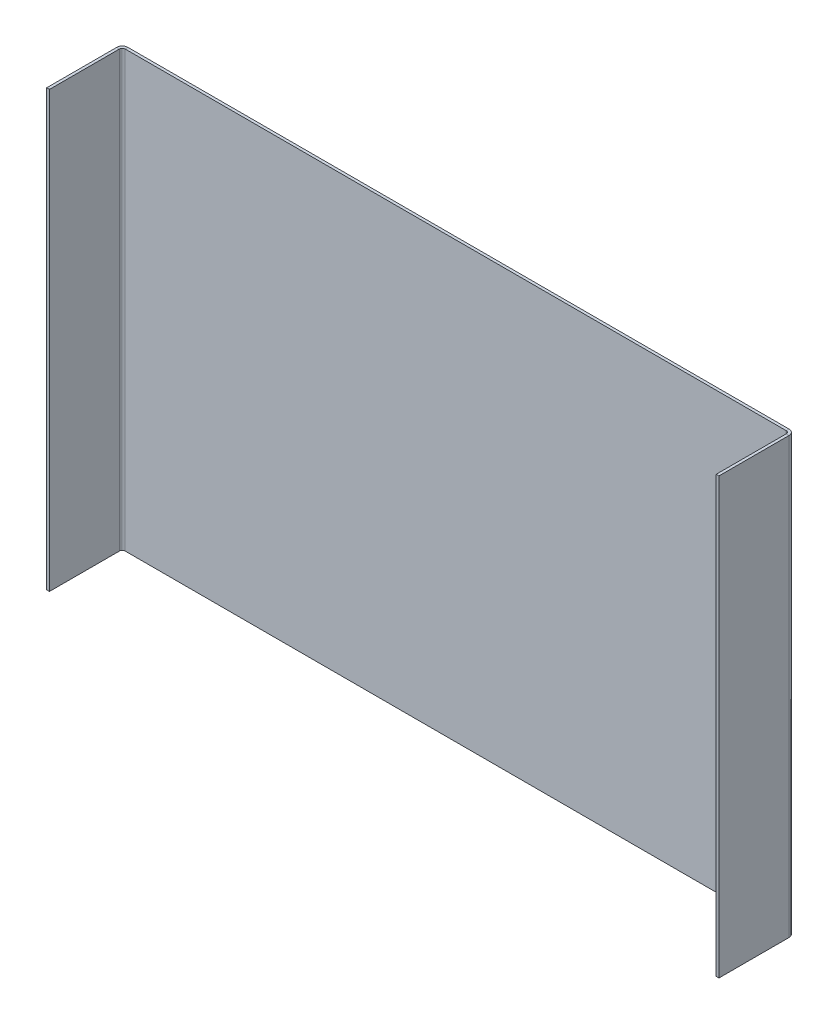
ISO-10303-21;
HEADER;
FILE_DESCRIPTION(('STEP AP214'),'2;1');
FILE_NAME('part.step','',(''),(''),'','','');
FILE_SCHEMA(('AUTOMOTIVE_DESIGN { 1 0 10303 214 1 1 1 1 }'));
ENDSEC;
DATA;
#1=APPLICATION_CONTEXT('core data for automotive mechanical design processes');
#2=APPLICATION_PROTOCOL_DEFINITION('international standard','automotive_design',2000,#1);
#3=PRODUCT_CONTEXT('',#1,'mechanical');
#4=PRODUCT('Part','Part','',(#3));
#5=PRODUCT_RELATED_PRODUCT_CATEGORY('part','',(#4));
#6=PRODUCT_DEFINITION_FORMATION('','',#4);
#7=PRODUCT_DEFINITION_CONTEXT('part definition',#1,'design');
#8=PRODUCT_DEFINITION('design','',#6,#7);
#9=PRODUCT_DEFINITION_SHAPE('','',#8);
#10=(LENGTH_UNIT() NAMED_UNIT(*) SI_UNIT(.MILLI.,.METRE.));
#11=(NAMED_UNIT(*) PLANE_ANGLE_UNIT() SI_UNIT($,.RADIAN.));
#12=(NAMED_UNIT(*) SI_UNIT($,.STERADIAN.) SOLID_ANGLE_UNIT());
#13=UNCERTAINTY_MEASURE_WITH_UNIT(LENGTH_MEASURE(1.E-05),#10,'distance_accuracy_value','');
#14=(GEOMETRIC_REPRESENTATION_CONTEXT(3) GLOBAL_UNCERTAINTY_ASSIGNED_CONTEXT((#13)) GLOBAL_UNIT_ASSIGNED_CONTEXT((#10,
#11,#12)) REPRESENTATION_CONTEXT('',''));
#15=CARTESIAN_POINT('',(0.,0.,0.));
#16=DIRECTION('',(0.,0.,1.));
#17=DIRECTION('',(1.,0.,0.));
#18=AXIS2_PLACEMENT_3D('',#15,#16,#17);
#19=CARTESIAN_POINT('',(1.4732,115.,-20.));
#20=DIRECTION('',(0.,1.,0.));
#21=DIRECTION('',(0.,0.,1.));
#22=AXIS2_PLACEMENT_3D('',#19,#20,#21);
#23=PLANE('',#22);
#24=DIRECTION('',(0.,0.,1.));
#25=VECTOR('',#24,1.);
#26=CARTESIAN_POINT('',(1.4732,115.,-20.));
#27=LINE('',#26,#25);
#28=CARTESIAN_POINT('',(1.4732,115.,-20.));
#29=VERTEX_POINT('',#28);
#30=CARTESIAN_POINT('',(1.4732,115.,-19.2634));
#31=VERTEX_POINT('',#30);
#32=EDGE_CURVE('E11',#29,#31,#27,.T.);
#33=ORIENTED_EDGE('',*,*,#32,.F.);
#34=CARTESIAN_POINT('',(1.4732,115.,-18.5268));
#35=DIRECTION('',(0.,1.,0.));
#36=DIRECTION('',(0.,0.,1.));
#37=AXIS2_PLACEMENT_3D('',#34,#35,#36);
#38=CIRCLE('',#37,1.4732);
#39=CARTESIAN_POINT('',(0.,115.,-18.5268));
#40=VERTEX_POINT('',#39);
#41=EDGE_CURVE('E247',#40,#29,#38,.F.);
#42=ORIENTED_EDGE('',*,*,#41,.F.);
#43=DIRECTION('',(-1.,0.,0.));
#44=VECTOR('',#43,1.);
#45=CARTESIAN_POINT('',(0.7366,115.,-18.5268));
#46=LINE('',#45,#44);
#47=CARTESIAN_POINT('',(0.7366,115.,-18.5268));
#48=VERTEX_POINT('',#47);
#49=EDGE_CURVE('E45',#48,#40,#46,.T.);
#50=ORIENTED_EDGE('',*,*,#49,.F.);
#51=CARTESIAN_POINT('',(1.4732,115.,-18.5268));
#52=DIRECTION('',(0.,1.,0.));
#53=DIRECTION('',(1.,0.,0.));
#54=AXIS2_PLACEMENT_3D('',#51,#52,#53);
#55=CIRCLE('',#54,0.7366);
#56=EDGE_CURVE('E146',#48,#31,#55,.F.);
#57=ORIENTED_EDGE('',*,*,#56,.T.);
#58=EDGE_LOOP('',(#33,#42,#50,#57));
#59=FACE_BOUND('',#58,.T.);
#60=ADVANCED_FACE('F37',(#59),#23,.T.);
#61=CARTESIAN_POINT('',(0.7366,115.,-18.5268));
#62=DIRECTION('',(0.,1.,0.));
#63=DIRECTION('',(0.,0.,1.));
#64=AXIS2_PLACEMENT_3D('',#61,#62,#63);
#65=PLANE('',#64);
#66=DIRECTION('',(1.,0.,0.));
#67=VECTOR('',#66,1.);
#68=CARTESIAN_POINT('',(0.,115.,-20.));
#69=LINE('',#68,#67);
#70=CARTESIAN_POINT('',(176.3268,115.,-20.));
#71=VERTEX_POINT('',#70);
#72=EDGE_CURVE('E140',#29,#71,#69,.T.);
#73=ORIENTED_EDGE('',*,*,#72,.F.);
#74=ORIENTED_EDGE('',*,*,#32,.T.);
#75=DIRECTION('',(1.,0.,0.));
#76=VECTOR('',#75,1.);
#77=CARTESIAN_POINT('',(0.,115.,-19.2634));
#78=LINE('',#77,#76);
#79=CARTESIAN_POINT('',(176.3268,115.,-19.2634));
#80=VERTEX_POINT('',#79);
#81=EDGE_CURVE('E137',#31,#80,#78,.T.);
#82=ORIENTED_EDGE('',*,*,#81,.T.);
#83=DIRECTION('',(0.,0.,-1.));
#84=VECTOR('',#83,1.);
#85=CARTESIAN_POINT('',(176.3268,115.,-19.2634));
#86=LINE('',#85,#84);
#87=EDGE_CURVE('E228',#80,#71,#86,.T.);
#88=ORIENTED_EDGE('',*,*,#87,.T.);
#89=EDGE_LOOP('',(#73,#74,#82,#88));
#90=FACE_BOUND('',#89,.T.);
#91=ADVANCED_FACE('F135',(#90),#65,.T.);
#92=CARTESIAN_POINT('',(0.,0.,-18.5268));
#93=DIRECTION('',(0.,-1.,0.));
#94=DIRECTION('',(0.,0.,-1.));
#95=AXIS2_PLACEMENT_3D('',#92,#93,#94);
#96=PLANE('',#95);
#97=DIRECTION('',(1.,0.,0.));
#98=VECTOR('',#97,1.);
#99=CARTESIAN_POINT('',(0.,0.,-18.5268));
#100=LINE('',#99,#98);
#101=CARTESIAN_POINT('',(0.,0.,-18.5268));
#102=VERTEX_POINT('',#101);
#103=CARTESIAN_POINT('',(0.7366,0.,-18.5268));
#104=VERTEX_POINT('',#103);
#105=EDGE_CURVE('E233',#102,#104,#100,.T.);
#106=ORIENTED_EDGE('',*,*,#105,.F.);
#107=CARTESIAN_POINT('',(1.4732,0.,-18.5268));
#108=DIRECTION('',(0.,1.,0.));
#109=DIRECTION('',(0.,0.,1.));
#110=AXIS2_PLACEMENT_3D('',#107,#108,#109);
#111=CIRCLE('',#110,1.4732);
#112=CARTESIAN_POINT('',(1.4732,0.,-20.));
#113=VERTEX_POINT('',#112);
#114=EDGE_CURVE('E185',#102,#113,#111,.F.);
#115=ORIENTED_EDGE('',*,*,#114,.T.);
#116=DIRECTION('',(0.,0.,-1.));
#117=VECTOR('',#116,1.);
#118=CARTESIAN_POINT('',(1.4732,0.,-19.2634));
#119=LINE('',#118,#117);
#120=CARTESIAN_POINT('',(1.4732,0.,-19.2634));
#121=VERTEX_POINT('',#120);
#122=EDGE_CURVE('E231',#121,#113,#119,.T.);
#123=ORIENTED_EDGE('',*,*,#122,.F.);
#124=CARTESIAN_POINT('',(1.4732,0.,-18.5268));
#125=DIRECTION('',(0.,1.,0.));
#126=DIRECTION('',(1.,0.,0.));
#127=AXIS2_PLACEMENT_3D('',#124,#125,#126);
#128=CIRCLE('',#127,0.7366);
#129=EDGE_CURVE('E158',#104,#121,#128,.F.);
#130=ORIENTED_EDGE('',*,*,#129,.F.);
#131=EDGE_LOOP('',(#106,#115,#123,#130));
#132=FACE_BOUND('',#131,.T.);
#133=ADVANCED_FACE('F285',(#132),#96,.T.);
#134=CARTESIAN_POINT('',(1.4732,0.,-19.2634));
#135=DIRECTION('',(0.,-1.,0.));
#136=DIRECTION('',(0.,0.,-1.));
#137=AXIS2_PLACEMENT_3D('',#134,#135,#136);
#138=PLANE('',#137);
#139=DIRECTION('',(0.,0.,-1.));
#140=VECTOR('',#139,1.);
#141=CARTESIAN_POINT('',(0.,0.,0.));
#142=LINE('',#141,#140);
#143=CARTESIAN_POINT('',(0.,0.,0.));
#144=VERTEX_POINT('',#143);
#145=EDGE_CURVE('E188',#144,#102,#142,.T.);
#146=ORIENTED_EDGE('',*,*,#145,.T.);
#147=ORIENTED_EDGE('',*,*,#105,.T.);
#148=DIRECTION('',(0.,0.,-1.));
#149=VECTOR('',#148,1.);
#150=CARTESIAN_POINT('',(0.7366,0.,0.));
#151=LINE('',#150,#149);
#152=CARTESIAN_POINT('',(0.7366,0.,0.));
#153=VERTEX_POINT('',#152);
#154=EDGE_CURVE('E194',#153,#104,#151,.T.);
#155=ORIENTED_EDGE('',*,*,#154,.F.);
#156=DIRECTION('',(-1.,0.,0.));
#157=VECTOR('',#156,1.);
#158=CARTESIAN_POINT('',(0.7366,0.,0.));
#159=LINE('',#158,#157);
#160=EDGE_CURVE('E191',#153,#144,#159,.T.);
#161=ORIENTED_EDGE('',*,*,#160,.T.);
#162=EDGE_LOOP('',(#146,#147,#155,#161));
#163=FACE_BOUND('',#162,.T.);
#164=ADVANCED_FACE('F288',(#163),#138,.T.);
#165=CARTESIAN_POINT('',(177.8,115.,-18.5268));
#166=DIRECTION('',(0.,1.,0.));
#167=DIRECTION('',(0.,0.,1.));
#168=AXIS2_PLACEMENT_3D('',#165,#166,#167);
#169=PLANE('',#168);
#170=DIRECTION('',(-1.,0.,0.));
#171=VECTOR('',#170,1.);
#172=CARTESIAN_POINT('',(177.8,115.,-18.5268));
#173=LINE('',#172,#171);
#174=CARTESIAN_POINT('',(177.8,115.,-18.5268));
#175=VERTEX_POINT('',#174);
#176=CARTESIAN_POINT('',(177.0634,115.,-18.5268));
#177=VERTEX_POINT('',#176);
#178=EDGE_CURVE('E53',#175,#177,#173,.T.);
#179=ORIENTED_EDGE('',*,*,#178,.F.);
#180=CARTESIAN_POINT('',(176.3268,115.,-18.5268));
#181=DIRECTION('',(0.,1.,0.));
#182=DIRECTION('',(0.,0.,1.));
#183=AXIS2_PLACEMENT_3D('',#180,#181,#182);
#184=CIRCLE('',#183,1.4732);
#185=EDGE_CURVE('E257',#71,#175,#184,.F.);
#186=ORIENTED_EDGE('',*,*,#185,.F.);
#187=ORIENTED_EDGE('',*,*,#87,.F.);
#188=CARTESIAN_POINT('',(176.3268,115.,-18.5268));
#189=DIRECTION('',(0.,1.,0.));
#190=DIRECTION('',(1.,0.,0.));
#191=AXIS2_PLACEMENT_3D('',#188,#189,#190);
#192=CIRCLE('',#191,0.7366);
#193=EDGE_CURVE('E166',#80,#177,#192,.F.);
#194=ORIENTED_EDGE('',*,*,#193,.T.);
#195=EDGE_LOOP('',(#179,#186,#187,#194));
#196=FACE_BOUND('',#195,.T.);
#197=ADVANCED_FACE('F280',(#196),#169,.T.);
#198=CARTESIAN_POINT('',(176.3268,115.,-19.2634));
#199=DIRECTION('',(0.,1.,0.));
#200=DIRECTION('',(0.,0.,1.));
#201=AXIS2_PLACEMENT_3D('',#198,#199,#200);
#202=PLANE('',#201);
#203=DIRECTION('',(0.,0.,1.));
#204=VECTOR('',#203,1.);
#205=CARTESIAN_POINT('',(177.8,115.,-20.));
#206=LINE('',#205,#204);
#207=CARTESIAN_POINT('',(177.8,115.,0.));
#208=VERTEX_POINT('',#207);
#209=EDGE_CURVE('E260',#175,#208,#206,.T.);
#210=ORIENTED_EDGE('',*,*,#209,.F.);
#211=ORIENTED_EDGE('',*,*,#178,.T.);
#212=DIRECTION('',(0.,0.,-1.));
#213=VECTOR('',#212,1.);
#214=CARTESIAN_POINT('',(177.0634,115.,-20.));
#215=LINE('',#214,#213);
#216=CARTESIAN_POINT('',(177.0634,115.,0.));
#217=VERTEX_POINT('',#216);
#218=EDGE_CURVE('E107',#177,#217,#215,.F.);
#219=ORIENTED_EDGE('',*,*,#218,.T.);
#220=DIRECTION('',(-1.,0.,0.));
#221=VECTOR('',#220,1.);
#222=CARTESIAN_POINT('',(177.8,115.,0.));
#223=LINE('',#222,#221);
#224=EDGE_CURVE('E263',#208,#217,#223,.T.);
#225=ORIENTED_EDGE('',*,*,#224,.F.);
#226=EDGE_LOOP('',(#210,#211,#219,#225));
#227=FACE_BOUND('',#226,.T.);
#228=ADVANCED_FACE('F269',(#227),#202,.T.);
#229=CARTESIAN_POINT('',(176.3268,0.,-20.));
#230=DIRECTION('',(0.,-1.,0.));
#231=DIRECTION('',(0.,0.,-1.));
#232=AXIS2_PLACEMENT_3D('',#229,#230,#231);
#233=PLANE('',#232);
#234=DIRECTION('',(0.,0.,1.));
#235=VECTOR('',#234,1.);
#236=CARTESIAN_POINT('',(176.3268,0.,-20.));
#237=LINE('',#236,#235);
#238=CARTESIAN_POINT('',(176.3268,0.,-20.));
#239=VERTEX_POINT('',#238);
#240=CARTESIAN_POINT('',(176.3268,0.,-19.2634));
#241=VERTEX_POINT('',#240);
#242=EDGE_CURVE('E94',#239,#241,#237,.T.);
#243=ORIENTED_EDGE('',*,*,#242,.F.);
#244=CARTESIAN_POINT('',(176.3268,0.,-18.5268));
#245=DIRECTION('',(0.,1.,0.));
#246=DIRECTION('',(0.,0.,1.));
#247=AXIS2_PLACEMENT_3D('',#244,#245,#246);
#248=CIRCLE('',#247,1.4732);
#249=CARTESIAN_POINT('',(177.8,0.,-18.5268));
#250=VERTEX_POINT('',#249);
#251=EDGE_CURVE('E181',#239,#250,#248,.F.);
#252=ORIENTED_EDGE('',*,*,#251,.T.);
#253=DIRECTION('',(1.,0.,0.));
#254=VECTOR('',#253,1.);
#255=CARTESIAN_POINT('',(177.0634,0.,-18.5268));
#256=LINE('',#255,#254);
#257=CARTESIAN_POINT('',(177.0634,0.,-18.5268));
#258=VERTEX_POINT('',#257);
#259=EDGE_CURVE('E101',#258,#250,#256,.T.);
#260=ORIENTED_EDGE('',*,*,#259,.F.);
#261=CARTESIAN_POINT('',(176.3268,0.,-18.5268));
#262=DIRECTION('',(0.,1.,0.));
#263=DIRECTION('',(1.,0.,0.));
#264=AXIS2_PLACEMENT_3D('',#261,#262,#263);
#265=CIRCLE('',#264,0.7366);
#266=EDGE_CURVE('E200',#241,#258,#265,.F.);
#267=ORIENTED_EDGE('',*,*,#266,.F.);
#268=EDGE_LOOP('',(#243,#252,#260,#267));
#269=FACE_BOUND('',#268,.T.);
#270=ADVANCED_FACE('F317',(#269),#233,.T.);
#271=CARTESIAN_POINT('',(177.0634,0.,-18.5268));
#272=DIRECTION('',(0.,-1.,0.));
#273=DIRECTION('',(0.,0.,-1.));
#274=AXIS2_PLACEMENT_3D('',#271,#272,#273);
#275=PLANE('',#274);
#276=DIRECTION('',(1.,0.,0.));
#277=VECTOR('',#276,1.);
#278=CARTESIAN_POINT('',(0.,0.,-20.));
#279=LINE('',#278,#277);
#280=EDGE_CURVE('E183',#113,#239,#279,.T.);
#281=ORIENTED_EDGE('',*,*,#280,.T.);
#282=ORIENTED_EDGE('',*,*,#242,.T.);
#283=DIRECTION('',(1.,0.,0.));
#284=VECTOR('',#283,1.);
#285=CARTESIAN_POINT('',(0.,0.,-19.2634));
#286=LINE('',#285,#284);
#287=EDGE_CURVE('E198',#121,#241,#286,.T.);
#288=ORIENTED_EDGE('',*,*,#287,.F.);
#289=ORIENTED_EDGE('',*,*,#122,.T.);
#290=EDGE_LOOP('',(#281,#282,#288,#289));
#291=FACE_BOUND('',#290,.T.);
#292=ADVANCED_FACE('F320',(#291),#275,.T.);
#293=CARTESIAN_POINT('',(177.0634,115.,-20.));
#294=DIRECTION('',(1.,0.,0.));
#295=DIRECTION('',(0.,0.,-1.));
#296=AXIS2_PLACEMENT_3D('',#293,#294,#295);
#297=PLANE('',#296);
#298=DIRECTION('',(0.,0.,-1.));
#299=VECTOR('',#298,1.);
#300=CARTESIAN_POINT('',(177.0634,0.,-20.));
#301=LINE('',#300,#299);
#302=CARTESIAN_POINT('',(177.0634,0.,0.));
#303=VERTEX_POINT('',#302);
#304=EDGE_CURVE('E172',#258,#303,#301,.F.);
#305=ORIENTED_EDGE('',*,*,#304,.T.);
#306=DIRECTION('',(0.,-1.,0.));
#307=VECTOR('',#306,1.);
#308=CARTESIAN_POINT('',(177.0634,115.,0.));
#309=LINE('',#308,#307);
#310=EDGE_CURVE('E224',#217,#303,#309,.T.);
#311=ORIENTED_EDGE('',*,*,#310,.F.);
#312=ORIENTED_EDGE('',*,*,#218,.F.);
#313=DIRECTION('',(0.,-1.,0.));
#314=VECTOR('',#313,1.);
#315=CARTESIAN_POINT('',(177.0634,115.,-18.5268));
#316=LINE('',#315,#314);
#317=EDGE_CURVE('E168',#177,#258,#316,.T.);
#318=ORIENTED_EDGE('',*,*,#317,.T.);
#319=EDGE_LOOP('',(#305,#311,#312,#318));
#320=FACE_BOUND('',#319,.T.);
#321=ADVANCED_FACE('F323',(#320),#297,.F.);
#322=CARTESIAN_POINT('',(177.8,115.,0.));
#323=DIRECTION('',(0.,0.,1.));
#324=DIRECTION('',(1.,0.,0.));
#325=AXIS2_PLACEMENT_3D('',#322,#323,#324);
#326=PLANE('',#325);
#327=DIRECTION('',(-1.,0.,0.));
#328=VECTOR('',#327,1.);
#329=CARTESIAN_POINT('',(177.8,0.,0.));
#330=LINE('',#329,#328);
#331=CARTESIAN_POINT('',(177.8,0.,0.));
#332=VERTEX_POINT('',#331);
#333=EDGE_CURVE('E175',#332,#303,#330,.T.);
#334=ORIENTED_EDGE('',*,*,#333,.F.);
#335=DIRECTION('',(0.,-1.,0.));
#336=VECTOR('',#335,1.);
#337=CARTESIAN_POINT('',(177.8,115.,0.));
#338=LINE('',#337,#336);
#339=EDGE_CURVE('E222',#208,#332,#338,.T.);
#340=ORIENTED_EDGE('',*,*,#339,.F.);
#341=ORIENTED_EDGE('',*,*,#224,.T.);
#342=ORIENTED_EDGE('',*,*,#310,.T.);
#343=EDGE_LOOP('',(#334,#340,#341,#342));
#344=FACE_BOUND('',#343,.T.);
#345=ADVANCED_FACE('F268',(#344),#326,.T.);
#346=CARTESIAN_POINT('',(177.8,115.,-20.));
#347=DIRECTION('',(1.,0.,0.));
#348=DIRECTION('',(0.,0.,-1.));
#349=AXIS2_PLACEMENT_3D('',#346,#347,#348);
#350=PLANE('',#349);
#351=DIRECTION('',(0.,0.,1.));
#352=VECTOR('',#351,1.);
#353=CARTESIAN_POINT('',(177.8,0.,-20.));
#354=LINE('',#353,#352);
#355=EDGE_CURVE('E178',#250,#332,#354,.T.);
#356=ORIENTED_EDGE('',*,*,#355,.F.);
#357=DIRECTION('',(0.,-1.,0.));
#358=VECTOR('',#357,1.);
#359=CARTESIAN_POINT('',(177.8,115.,-18.5268));
#360=LINE('',#359,#358);
#361=EDGE_CURVE('E219',#175,#250,#360,.T.);
#362=ORIENTED_EDGE('',*,*,#361,.F.);
#363=ORIENTED_EDGE('',*,*,#209,.T.);
#364=ORIENTED_EDGE('',*,*,#339,.T.);
#365=EDGE_LOOP('',(#356,#362,#363,#364));
#366=FACE_BOUND('',#365,.T.);
#367=ADVANCED_FACE('F273',(#366),#350,.T.);
#368=CARTESIAN_POINT('',(176.3268,115.,-18.5268));
#369=DIRECTION('',(0.,-1.,0.));
#370=DIRECTION('',(0.,0.,-1.));
#371=AXIS2_PLACEMENT_3D('',#368,#369,#370);
#372=CYLINDRICAL_SURFACE('',#371,1.4732);
#373=ORIENTED_EDGE('',*,*,#251,.F.);
#374=DIRECTION('',(0.,-1.,0.));
#375=VECTOR('',#374,1.);
#376=CARTESIAN_POINT('',(176.3268,115.,-20.));
#377=LINE('',#376,#375);
#378=EDGE_CURVE('E216',#71,#239,#377,.T.);
#379=ORIENTED_EDGE('',*,*,#378,.F.);
#380=ORIENTED_EDGE('',*,*,#185,.T.);
#381=ORIENTED_EDGE('',*,*,#361,.T.);
#382=EDGE_LOOP('',(#373,#379,#380,#381));
#383=FACE_BOUND('',#382,.T.);
#384=ADVANCED_FACE('F276',(#383),#372,.T.);
#385=CARTESIAN_POINT('',(0.,115.,-20.));
#386=DIRECTION('',(0.,0.,-1.));
#387=DIRECTION('',(-1.,0.,0.));
#388=AXIS2_PLACEMENT_3D('',#385,#386,#387);
#389=PLANE('',#388);
#390=ORIENTED_EDGE('',*,*,#280,.F.);
#391=DIRECTION('',(0.,-1.,0.));
#392=VECTOR('',#391,1.);
#393=CARTESIAN_POINT('',(1.4732,115.,-20.));
#394=LINE('',#393,#392);
#395=EDGE_CURVE('E213',#29,#113,#394,.T.);
#396=ORIENTED_EDGE('',*,*,#395,.F.);
#397=ORIENTED_EDGE('',*,*,#72,.T.);
#398=ORIENTED_EDGE('',*,*,#378,.T.);
#399=EDGE_LOOP('',(#390,#396,#397,#398));
#400=FACE_BOUND('',#399,.T.);
#401=ADVANCED_FACE('F283',(#400),#389,.T.);
#402=CARTESIAN_POINT('',(1.4732,115.,-18.5268));
#403=DIRECTION('',(0.,-1.,0.));
#404=DIRECTION('',(0.,0.,-1.));
#405=AXIS2_PLACEMENT_3D('',#402,#403,#404);
#406=CYLINDRICAL_SURFACE('',#405,1.4732);
#407=ORIENTED_EDGE('',*,*,#114,.F.);
#408=DIRECTION('',(0.,-1.,0.));
#409=VECTOR('',#408,1.);
#410=CARTESIAN_POINT('',(0.,115.,-18.5268));
#411=LINE('',#410,#409);
#412=EDGE_CURVE('E210',#40,#102,#411,.T.);
#413=ORIENTED_EDGE('',*,*,#412,.F.);
#414=ORIENTED_EDGE('',*,*,#41,.T.);
#415=ORIENTED_EDGE('',*,*,#395,.T.);
#416=EDGE_LOOP('',(#407,#413,#414,#415));
#417=FACE_BOUND('',#416,.T.);
#418=ADVANCED_FACE('F246',(#417),#406,.T.);
#419=CARTESIAN_POINT('',(0.,115.,0.));
#420=DIRECTION('',(-1.,0.,0.));
#421=DIRECTION('',(0.,0.,1.));
#422=AXIS2_PLACEMENT_3D('',#419,#420,#421);
#423=PLANE('',#422);
#424=ORIENTED_EDGE('',*,*,#145,.F.);
#425=DIRECTION('',(0.,-1.,0.));
#426=VECTOR('',#425,1.);
#427=CARTESIAN_POINT('',(0.,115.,0.));
#428=LINE('',#427,#426);
#429=CARTESIAN_POINT('',(0.,115.,0.));
#430=VERTEX_POINT('',#429);
#431=EDGE_CURVE('E208',#430,#144,#428,.T.);
#432=ORIENTED_EDGE('',*,*,#431,.F.);
#433=DIRECTION('',(0.,0.,-1.));
#434=VECTOR('',#433,1.);
#435=CARTESIAN_POINT('',(0.,115.,0.));
#436=LINE('',#435,#434);
#437=EDGE_CURVE('E240',#430,#40,#436,.T.);
#438=ORIENTED_EDGE('',*,*,#437,.T.);
#439=ORIENTED_EDGE('',*,*,#412,.T.);
#440=EDGE_LOOP('',(#424,#432,#438,#439));
#441=FACE_BOUND('',#440,.T.);
#442=ADVANCED_FACE('F251',(#441),#423,.T.);
#443=CARTESIAN_POINT('',(0.7366,115.,0.));
#444=DIRECTION('',(0.,0.,1.));
#445=DIRECTION('',(1.,0.,0.));
#446=AXIS2_PLACEMENT_3D('',#443,#444,#445);
#447=PLANE('',#446);
#448=ORIENTED_EDGE('',*,*,#160,.F.);
#449=DIRECTION('',(0.,-1.,0.));
#450=VECTOR('',#449,1.);
#451=CARTESIAN_POINT('',(0.7366,115.,0.));
#452=LINE('',#451,#450);
#453=CARTESIAN_POINT('',(0.7366,115.,0.));
#454=VERTEX_POINT('',#453);
#455=EDGE_CURVE('E206',#454,#153,#452,.T.);
#456=ORIENTED_EDGE('',*,*,#455,.F.);
#457=DIRECTION('',(-1.,0.,0.));
#458=VECTOR('',#457,1.);
#459=CARTESIAN_POINT('',(0.7366,115.,0.));
#460=LINE('',#459,#458);
#461=EDGE_CURVE('E252',#454,#430,#460,.T.);
#462=ORIENTED_EDGE('',*,*,#461,.T.);
#463=ORIENTED_EDGE('',*,*,#431,.T.);
#464=EDGE_LOOP('',(#448,#456,#462,#463));
#465=FACE_BOUND('',#464,.T.);
#466=ADVANCED_FACE('F293',(#465),#447,.T.);
#467=CARTESIAN_POINT('',(0.7366,115.,0.));
#468=DIRECTION('',(-1.,0.,0.));
#469=DIRECTION('',(0.,0.,1.));
#470=AXIS2_PLACEMENT_3D('',#467,#468,#469);
#471=PLANE('',#470);
#472=ORIENTED_EDGE('',*,*,#154,.T.);
#473=DIRECTION('',(0.,-1.,0.));
#474=VECTOR('',#473,1.);
#475=CARTESIAN_POINT('',(0.7366,115.,-18.5268));
#476=LINE('',#475,#474);
#477=EDGE_CURVE('E160',#48,#104,#476,.T.);
#478=ORIENTED_EDGE('',*,*,#477,.F.);
#479=DIRECTION('',(0.,0.,-1.));
#480=VECTOR('',#479,1.);
#481=CARTESIAN_POINT('',(0.7366,115.,0.));
#482=LINE('',#481,#480);
#483=EDGE_CURVE('E151',#454,#48,#482,.T.);
#484=ORIENTED_EDGE('',*,*,#483,.F.);
#485=ORIENTED_EDGE('',*,*,#455,.T.);
#486=EDGE_LOOP('',(#472,#478,#484,#485));
#487=FACE_BOUND('',#486,.T.);
#488=ADVANCED_FACE('F291',(#487),#471,.F.);
#489=CARTESIAN_POINT('',(1.4732,115.,-18.5268));
#490=DIRECTION('',(0.,-1.,0.));
#491=DIRECTION('',(0.,0.,-1.));
#492=AXIS2_PLACEMENT_3D('',#489,#490,#491);
#493=CYLINDRICAL_SURFACE('',#492,0.7366);
#494=ORIENTED_EDGE('',*,*,#129,.T.);
#495=DIRECTION('',(0.,-1.,0.));
#496=VECTOR('',#495,1.);
#497=CARTESIAN_POINT('',(1.4732,115.,-19.2634));
#498=LINE('',#497,#496);
#499=EDGE_CURVE('E155',#31,#121,#498,.T.);
#500=ORIENTED_EDGE('',*,*,#499,.F.);
#501=ORIENTED_EDGE('',*,*,#56,.F.);
#502=ORIENTED_EDGE('',*,*,#477,.T.);
#503=EDGE_LOOP('',(#494,#500,#501,#502));
#504=FACE_BOUND('',#503,.T.);
#505=ADVANCED_FACE('F156',(#504),#493,.F.);
#506=CARTESIAN_POINT('',(0.,115.,-19.2634));
#507=DIRECTION('',(0.,0.,-1.));
#508=DIRECTION('',(-1.,0.,0.));
#509=AXIS2_PLACEMENT_3D('',#506,#507,#508);
#510=PLANE('',#509);
#511=ORIENTED_EDGE('',*,*,#287,.T.);
#512=DIRECTION('',(0.,-1.,0.));
#513=VECTOR('',#512,1.);
#514=CARTESIAN_POINT('',(176.3268,115.,-19.2634));
#515=LINE('',#514,#513);
#516=EDGE_CURVE('E161',#80,#241,#515,.T.);
#517=ORIENTED_EDGE('',*,*,#516,.F.);
#518=ORIENTED_EDGE('',*,*,#81,.F.);
#519=ORIENTED_EDGE('',*,*,#499,.T.);
#520=EDGE_LOOP('',(#511,#517,#518,#519));
#521=FACE_BOUND('',#520,.T.);
#522=ADVANCED_FACE('F163',(#521),#510,.F.);
#523=CARTESIAN_POINT('',(176.3268,115.,-18.5268));
#524=DIRECTION('',(0.,-1.,0.));
#525=DIRECTION('',(0.,0.,-1.));
#526=AXIS2_PLACEMENT_3D('',#523,#524,#525);
#527=CYLINDRICAL_SURFACE('',#526,0.7366);
#528=ORIENTED_EDGE('',*,*,#266,.T.);
#529=ORIENTED_EDGE('',*,*,#317,.F.);
#530=ORIENTED_EDGE('',*,*,#193,.F.);
#531=ORIENTED_EDGE('',*,*,#516,.T.);
#532=EDGE_LOOP('',(#528,#529,#530,#531));
#533=FACE_BOUND('',#532,.T.);
#534=ADVANCED_FACE('F375',(#533),#527,.F.);
#535=CARTESIAN_POINT('',(176.3268,115.,-18.5268));
#536=DIRECTION('',(0.,1.,0.));
#537=DIRECTION('',(1.,0.,0.));
#538=AXIS2_PLACEMENT_3D('',#535,#536,#537);
#539=PLANE('',#538);
#540=ORIENTED_EDGE('',*,*,#483,.T.);
#541=ORIENTED_EDGE('',*,*,#49,.T.);
#542=ORIENTED_EDGE('',*,*,#437,.F.);
#543=ORIENTED_EDGE('',*,*,#461,.F.);
#544=EDGE_LOOP('',(#540,#541,#542,#543));
#545=FACE_BOUND('',#544,.T.);
#546=ADVANCED_FACE('F237',(#545),#539,.T.);
#547=CARTESIAN_POINT('',(176.3268,0.,-18.5268));
#548=DIRECTION('',(0.,1.,0.));
#549=DIRECTION('',(1.,0.,0.));
#550=AXIS2_PLACEMENT_3D('',#547,#548,#549);
#551=PLANE('',#550);
#552=ORIENTED_EDGE('',*,*,#304,.F.);
#553=ORIENTED_EDGE('',*,*,#259,.T.);
#554=ORIENTED_EDGE('',*,*,#355,.T.);
#555=ORIENTED_EDGE('',*,*,#333,.T.);
#556=EDGE_LOOP('',(#552,#553,#554,#555));
#557=FACE_BOUND('',#556,.T.);
#558=ADVANCED_FACE('F395',(#557),#551,.F.);
#559=CLOSED_SHELL('',(#60,#91,#133,#164,#197,#228,#270,#292,#321,#345,#367,#384,#401,#418,#442,
#466,#488,#505,#522,#534,#546,#558));
#560=MANIFOLD_SOLID_BREP('B2',#559);
#561=ADVANCED_BREP_SHAPE_REPRESENTATION('',(#18,#560),#14);
#562=SHAPE_DEFINITION_REPRESENTATION(#9,#561);
ENDSEC;
END-ISO-10303-21;
